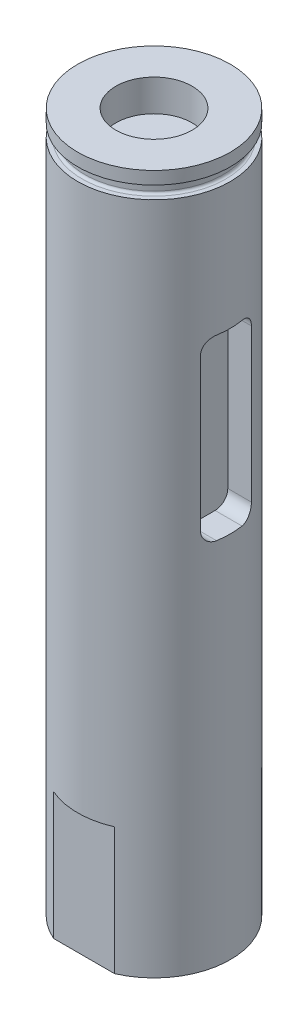
ISO-10303-21;
HEADER;
FILE_DESCRIPTION(('STEP AP214'),'2;1');
FILE_NAME('part.step','',(''),(''),'','','');
FILE_SCHEMA(('AUTOMOTIVE_DESIGN { 1 0 10303 214 1 1 1 1 }'));
ENDSEC;
DATA;
#1=APPLICATION_CONTEXT('core data for automotive mechanical design processes');
#2=APPLICATION_PROTOCOL_DEFINITION('international standard','automotive_design',2000,#1);
#3=PRODUCT_CONTEXT('',#1,'mechanical');
#4=PRODUCT('Part','Part','',(#3));
#5=PRODUCT_RELATED_PRODUCT_CATEGORY('part','',(#4));
#6=PRODUCT_DEFINITION_FORMATION('','',#4);
#7=PRODUCT_DEFINITION_CONTEXT('part definition',#1,'design');
#8=PRODUCT_DEFINITION('design','',#6,#7);
#9=PRODUCT_DEFINITION_SHAPE('','',#8);
#10=(LENGTH_UNIT() NAMED_UNIT(*) SI_UNIT(.MILLI.,.METRE.));
#11=(NAMED_UNIT(*) PLANE_ANGLE_UNIT() SI_UNIT($,.RADIAN.));
#12=(NAMED_UNIT(*) SI_UNIT($,.STERADIAN.) SOLID_ANGLE_UNIT());
#13=UNCERTAINTY_MEASURE_WITH_UNIT(LENGTH_MEASURE(1.E-05),#10,'distance_accuracy_value','');
#14=(GEOMETRIC_REPRESENTATION_CONTEXT(3) GLOBAL_UNCERTAINTY_ASSIGNED_CONTEXT((#13)) GLOBAL_UNIT_ASSIGNED_CONTEXT((#10,
#11,#12)) REPRESENTATION_CONTEXT('',''));
#15=CARTESIAN_POINT('',(0.,0.,0.));
#16=DIRECTION('',(0.,0.,1.));
#17=DIRECTION('',(1.,0.,0.));
#18=AXIS2_PLACEMENT_3D('',#15,#16,#17);
#19=CARTESIAN_POINT('',(0.,14.,0.));
#20=DIRECTION('',(0.,-1.,0.));
#21=DIRECTION('',(0.,0.,-1.));
#22=AXIS2_PLACEMENT_3D('',#19,#20,#21);
#23=CYLINDRICAL_SURFACE('',#22,6.);
#24=CARTESIAN_POINT('',(0.,26.,0.));
#25=DIRECTION('',(0.,1.,0.));
#26=DIRECTION('',(0.,0.,1.));
#27=AXIS2_PLACEMENT_3D('',#24,#25,#26);
#28=CIRCLE('',#27,6.);
#29=CARTESIAN_POINT('',(0.,26.,6.));
#30=VERTEX_POINT('',#29);
#31=EDGE_CURVE('E219',#30,#30,#28,.T.);
#32=ORIENTED_EDGE('',*,*,#31,.F.);
#33=EDGE_LOOP('',(#32));
#34=FACE_BOUND('',#33,.T.);
#35=CARTESIAN_POINT('',(0.,25.,0.));
#36=DIRECTION('',(0.,-1.,0.));
#37=DIRECTION('',(0.,0.,-1.));
#38=AXIS2_PLACEMENT_3D('',#35,#36,#37);
#39=CIRCLE('',#38,6.);
#40=CARTESIAN_POINT('',(0.,25.,-6.));
#41=VERTEX_POINT('',#40);
#42=EDGE_CURVE('E223',#41,#41,#39,.T.);
#43=ORIENTED_EDGE('',*,*,#42,.F.);
#44=EDGE_LOOP('',(#43));
#45=FACE_BOUND('',#44,.T.);
#46=ADVANCED_FACE('F41',(#34,#45),#23,.T.);
#47=CARTESIAN_POINT('',(0.,26.,0.));
#48=DIRECTION('',(0.,1.,0.));
#49=DIRECTION('',(0.,0.,1.));
#50=AXIS2_PLACEMENT_3D('',#47,#48,#49);
#51=PLANE('',#50);
#52=CARTESIAN_POINT('',(0.,26.,0.));
#53=DIRECTION('',(0.,1.,0.));
#54=DIRECTION('',(0.,0.,1.));
#55=AXIS2_PLACEMENT_3D('',#52,#53,#54);
#56=CIRCLE('',#55,3.);
#57=CARTESIAN_POINT('',(0.,26.,3.));
#58=VERTEX_POINT('',#57);
#59=EDGE_CURVE('E135',#58,#58,#56,.T.);
#60=ORIENTED_EDGE('',*,*,#59,.F.);
#61=EDGE_LOOP('',(#60));
#62=FACE_BOUND('',#61,.T.);
#63=ORIENTED_EDGE('',*,*,#31,.T.);
#64=EDGE_LOOP('',(#63));
#65=FACE_BOUND('',#64,.T.);
#66=ADVANCED_FACE('F302',(#62,#65),#51,.T.);
#67=CARTESIAN_POINT('',(-5.5030110244233,25.,-1.28037871939337));
#68=DIRECTION('',(0.,-1.,0.));
#69=DIRECTION('',(0.,0.,-1.));
#70=AXIS2_PLACEMENT_3D('',#67,#68,#69);
#71=PLANE('',#70);
#72=CARTESIAN_POINT('',(0.,25.,0.));
#73=DIRECTION('',(0.,-1.,0.));
#74=DIRECTION('',(0.,0.,-1.));
#75=AXIS2_PLACEMENT_3D('',#72,#73,#74);
#76=CIRCLE('',#75,5.64999999999998);
#77=CARTESIAN_POINT('',(0.,25.,-5.64999999999998));
#78=VERTEX_POINT('',#77);
#79=EDGE_CURVE('E215',#78,#78,#76,.T.);
#80=ORIENTED_EDGE('',*,*,#79,.F.);
#81=EDGE_LOOP('',(#80));
#82=FACE_BOUND('',#81,.T.);
#83=ORIENTED_EDGE('',*,*,#42,.T.);
#84=EDGE_LOOP('',(#83));
#85=FACE_BOUND('',#84,.T.);
#86=ADVANCED_FACE('F307',(#82,#85),#71,.T.);
#87=CARTESIAN_POINT('',(-6.98833700889154,24.,-1.6259676657783));
#88=DIRECTION('',(0.,1.,0.));
#89=DIRECTION('',(0.,0.,1.));
#90=AXIS2_PLACEMENT_3D('',#87,#88,#89);
#91=PLANE('',#90);
#92=CARTESIAN_POINT('',(0.,24.,0.));
#93=DIRECTION('',(0.,-1.,0.));
#94=DIRECTION('',(0.,0.,-1.));
#95=AXIS2_PLACEMENT_3D('',#92,#93,#94);
#96=CIRCLE('',#95,5.64999999999998);
#97=CARTESIAN_POINT('',(0.,24.,-5.64999999999998));
#98=VERTEX_POINT('',#97);
#99=EDGE_CURVE('E187',#98,#98,#96,.T.);
#100=ORIENTED_EDGE('',*,*,#99,.T.);
#101=EDGE_LOOP('',(#100));
#102=FACE_BOUND('',#101,.T.);
#103=CARTESIAN_POINT('',(0.,24.,0.));
#104=DIRECTION('',(0.,1.,0.));
#105=DIRECTION('',(0.,0.,1.));
#106=AXIS2_PLACEMENT_3D('',#103,#104,#105);
#107=CIRCLE('',#106,6.);
#108=CARTESIAN_POINT('',(0.,24.,6.));
#109=VERTEX_POINT('',#108);
#110=EDGE_CURVE('E218',#109,#109,#107,.T.);
#111=ORIENTED_EDGE('',*,*,#110,.T.);
#112=EDGE_LOOP('',(#111));
#113=FACE_BOUND('',#112,.T.);
#114=ADVANCED_FACE('F266',(#102,#113),#91,.T.);
#115=CARTESIAN_POINT('',(0.,24.8,0.));
#116=DIRECTION('',(0.,-1.,0.));
#117=DIRECTION('',(0.,0.,-1.));
#118=AXIS2_PLACEMENT_3D('',#115,#116,#117);
#119=TOROIDAL_SURFACE('',#118,5.64999999999998,0.199999999999999);
#120=ORIENTED_EDGE('',*,*,#79,.T.);
#121=EDGE_LOOP('',(#120));
#122=FACE_BOUND('',#121,.T.);
#123=CARTESIAN_POINT('',(0.,24.8,0.));
#124=DIRECTION('',(0.,-1.,0.));
#125=DIRECTION('',(0.,0.,-1.));
#126=AXIS2_PLACEMENT_3D('',#123,#124,#125);
#127=CIRCLE('',#126,5.44999999999998);
#128=CARTESIAN_POINT('',(0.,24.8,-5.44999999999998));
#129=VERTEX_POINT('',#128);
#130=EDGE_CURVE('E212',#129,#129,#127,.T.);
#131=ORIENTED_EDGE('',*,*,#130,.F.);
#132=EDGE_LOOP('',(#131));
#133=FACE_BOUND('',#132,.T.);
#134=ADVANCED_FACE('F321',(#122,#133),#119,.F.);
#135=CARTESIAN_POINT('',(0.,60.2246155762171,0.));
#136=DIRECTION('',(0.,-1.,0.));
#137=DIRECTION('',(0.,0.,-1.));
#138=AXIS2_PLACEMENT_3D('',#135,#136,#137);
#139=CYLINDRICAL_SURFACE('',#138,5.44999999999998);
#140=ORIENTED_EDGE('',*,*,#130,.T.);
#141=EDGE_LOOP('',(#140));
#142=FACE_BOUND('',#141,.T.);
#143=CARTESIAN_POINT('',(0.,24.2,0.));
#144=DIRECTION('',(0.,-1.,0.));
#145=DIRECTION('',(0.,0.,-1.));
#146=AXIS2_PLACEMENT_3D('',#143,#144,#145);
#147=CIRCLE('',#146,5.44999999999998);
#148=CARTESIAN_POINT('',(0.,24.2,-5.44999999999998));
#149=VERTEX_POINT('',#148);
#150=EDGE_CURVE('E209',#149,#149,#147,.T.);
#151=ORIENTED_EDGE('',*,*,#150,.F.);
#152=EDGE_LOOP('',(#151));
#153=FACE_BOUND('',#152,.T.);
#154=ADVANCED_FACE('F316',(#142,#153),#139,.T.);
#155=CARTESIAN_POINT('',(0.,24.2,0.));
#156=DIRECTION('',(0.,-1.,0.));
#157=DIRECTION('',(0.,0.,-1.));
#158=AXIS2_PLACEMENT_3D('',#155,#156,#157);
#159=TOROIDAL_SURFACE('',#158,5.64999999999998,0.200000000000001);
#160=ORIENTED_EDGE('',*,*,#150,.T.);
#161=EDGE_LOOP('',(#160));
#162=FACE_BOUND('',#161,.T.);
#163=ORIENTED_EDGE('',*,*,#99,.F.);
#164=EDGE_LOOP('',(#163));
#165=FACE_BOUND('',#164,.T.);
#166=ADVANCED_FACE('F312',(#162,#165),#159,.F.);
#167=CARTESIAN_POINT('',(5.65685424949238,13.,2.));
#168=CARTESIAN_POINT('',(5.65685281758847,13.0271406195603,2.00000068443079));
#169=CARTESIAN_POINT('',(5.65724528085204,13.0542675920684,1.99889434448995));
#170=CARTESIAN_POINT('',(5.6588012761065,13.1083144843186,1.99448646917785));
#171=CARTESIAN_POINT('',(5.65996464010897,13.1352344478778,1.99118541206102));
#172=CARTESIAN_POINT('',(5.66457521184169,13.2152401355786,1.97804922022411));
#173=CARTESIAN_POINT('',(5.66914314724227,13.2677689800047,1.96498074668407));
#174=CARTESIAN_POINT('',(5.68090860038521,13.3697230095197,1.93069959561032));
#175=CARTESIAN_POINT('',(5.68810526955666,13.4191491901403,1.9094895461135));
#176=CARTESIAN_POINT('',(5.70460377121356,13.5137250019919,1.85961919606177));
#177=CARTESIAN_POINT('',(5.71390655255376,13.5588726926135,1.8309555366067));
#178=CARTESIAN_POINT('',(5.73431154730347,13.6451375632919,1.76602975759629));
#179=CARTESIAN_POINT('',(5.74546034987069,13.6860878211444,1.72956083672167));
#180=CARTESIAN_POINT('',(5.76864525641675,13.7613938194103,1.65058296050603));
#181=CARTESIAN_POINT('',(5.78068166050162,13.7957473151193,1.60807195773592));
#182=CARTESIAN_POINT('',(5.80552437460228,13.8584792321005,1.51600134393854));
#183=CARTESIAN_POINT('',(5.81834064122393,13.8865103779642,1.4662075429958));
#184=CARTESIAN_POINT('',(5.84349667083966,13.9337243082299,1.36249366414905));
#185=CARTESIAN_POINT('',(5.85583668949863,13.9529119024149,1.30857584784197));
#186=CARTESIAN_POINT('',(5.87643252247859,13.9781638653744,1.21215171656683));
#187=CARTESIAN_POINT('',(5.88492838409539,13.9863254878199,1.17023429589879));
#188=CARTESIAN_POINT('',(5.90113547403364,13.997246789207,1.08558012495498));
#189=CARTESIAN_POINT('',(5.9088471580345,14.0000096225441,1.04284386785744));
#190=CARTESIAN_POINT('',(5.91607978309962,14.,0.999999999999991));
#191=B_SPLINE_CURVE_WITH_KNOTS('',3,(#167,#168,#169,#170,#171,#172,#173,#174,#175,#176,#177,
#178,#179,#180,#181,#182,#183,#184,#185,#186,#187,#188,#189,#190),.UNSPECIFIED.,.F.,.F.,(4,2,2,
2,2,2,2,2,2,2,2,4),(0.,0.0813697321983587,0.162721738793672,0.32484161317144,0.486909200471364,
0.649049948975738,0.816183527372726,0.98337387653829,1.15825003972454,1.33303097964982,
1.46332089535386,1.59353466269523),.UNSPECIFIED.);
#192=CARTESIAN_POINT('',(5.65685424949238,13.,2.));
#193=VERTEX_POINT('',#192);
#194=CARTESIAN_POINT('',(5.91607978309962,14.,0.999999999999991));
#195=VERTEX_POINT('',#194);
#196=EDGE_CURVE('E11',#193,#195,#191,.T.);
#197=ORIENTED_EDGE('',*,*,#196,.T.);
#198=CARTESIAN_POINT('',(0.,14.,0.));
#199=DIRECTION('',(0.,1.,0.));
#200=DIRECTION('',(0.,0.,1.));
#201=AXIS2_PLACEMENT_3D('',#198,#199,#200);
#202=CIRCLE('',#201,6.);
#203=CARTESIAN_POINT('',(5.91607978309962,14.,-0.999999999999995));
#204=VERTEX_POINT('',#203);
#205=EDGE_CURVE('E222',#195,#204,#202,.T.);
#206=ORIENTED_EDGE('',*,*,#205,.T.);
#207=CARTESIAN_POINT('',(5.91607978309962,14.,-0.999999999999995));
#208=CARTESIAN_POINT('',(5.90640201240202,14.0000405759305,-1.05744405022136));
#209=CARTESIAN_POINT('',(5.89583336415347,13.9950540251957,-1.11469490219437));
#210=CARTESIAN_POINT('',(5.87342883441462,13.9755064421206,-1.22719911952359));
#211=CARTESIAN_POINT('',(5.86159482267549,13.9609593774531,-1.28245527503211));
#212=CARTESIAN_POINT('',(5.83714545083267,13.9227718025127,-1.3895245154396));
#213=CARTESIAN_POINT('',(5.82453024988558,13.8991331394476,-1.44133829724499));
#214=CARTESIAN_POINT('',(5.79916937690871,13.8434427114986,-1.54020609997988));
#215=CARTESIAN_POINT('',(5.78642367719668,13.8113891245001,-1.58725908697602));
#216=CARTESIAN_POINT('',(5.76135962724091,13.7391715845628,-1.67597570419013));
#217=CARTESIAN_POINT('',(5.74904982620252,13.6988997432736,-1.71755407861729));
#218=CARTESIAN_POINT('',(5.72586828747516,13.6115398739341,-1.79332249125908));
#219=CARTESIAN_POINT('',(5.71499666127697,13.5644513180274,-1.82751195679762));
#220=CARTESIAN_POINT('',(5.69567987862656,13.465585087445,-1.88684681266635));
#221=CARTESIAN_POINT('',(5.68719561514925,13.4139038103449,-1.91213990115031));
#222=CARTESIAN_POINT('',(5.67310524768226,13.3066504059048,-1.95355076042549));
#223=CARTESIAN_POINT('',(5.66749538055871,13.2510834745676,-1.96968053077614));
#224=CARTESIAN_POINT('',(5.6613503883933,13.1625046523593,-1.98724803334924));
#225=CARTESIAN_POINT('',(5.65966926284069,13.1301979434468,-1.99202469666343));
#226=CARTESIAN_POINT('',(5.65741979831632,13.0652670547078,-1.99840074381591));
#227=CARTESIAN_POINT('',(5.65685035299174,13.0326432230228,-2.0000032865869));
#228=CARTESIAN_POINT('',(5.65685424949238,13.,-2.));
#229=B_SPLINE_CURVE_WITH_KNOTS('',3,(#207,#208,#209,#210,#211,#212,#213,#214,#215,#216,#217,
#218,#219,#220,#221,#222,#223,#224,#225,#226,#227,#228),.UNSPECIFIED.,.F.,.F.,(4,2,2,2,2,2,2,2,
2,2,4),(0.,0.174480157541033,0.34870596889463,0.522896400176898,0.697124580713412,
0.873807076246497,1.05050326061842,1.22410957268253,1.39748801643219,1.49543358137948,
1.59328162034533),.UNSPECIFIED.);
#230=CARTESIAN_POINT('',(5.65685424949238,13.,-2.));
#231=VERTEX_POINT('',#230);
#232=EDGE_CURVE('E233',#204,#231,#229,.T.);
#233=ORIENTED_EDGE('',*,*,#232,.T.);
#234=DIRECTION('',(0.,-1.,0.));
#235=VECTOR('',#234,1.);
#236=CARTESIAN_POINT('',(5.65685424949238,14.,-2.));
#237=LINE('',#236,#235);
#238=CARTESIAN_POINT('',(5.65685424949238,1.00000000000001,-2.));
#239=VERTEX_POINT('',#238);
#240=EDGE_CURVE('E276',#231,#239,#237,.T.);
#241=ORIENTED_EDGE('',*,*,#240,.T.);
#242=CARTESIAN_POINT('',(5.65685424949238,1.00000000000001,-2.));
#243=CARTESIAN_POINT('',(5.65685281758846,0.972859380439662,-2.00000068443079));
#244=CARTESIAN_POINT('',(5.65724528085204,0.945732407931599,-1.99889434448995));
#245=CARTESIAN_POINT('',(5.6588012761065,0.891685515681443,-1.99448646917786));
#246=CARTESIAN_POINT('',(5.65996464010897,0.864765552122218,-1.99118541206103));
#247=CARTESIAN_POINT('',(5.66457521184169,0.784759864421369,-1.97804922022412));
#248=CARTESIAN_POINT('',(5.66914314724227,0.732231019995348,-1.96498074668407));
#249=CARTESIAN_POINT('',(5.68090860038521,0.630276990480267,-1.93069959561032));
#250=CARTESIAN_POINT('',(5.68810526955666,0.580850809859671,-1.90948954611351));
#251=CARTESIAN_POINT('',(5.70460377121355,0.486274998008095,-1.85961919606177));
#252=CARTESIAN_POINT('',(5.71390655255376,0.441127307386551,-1.8309555366067));
#253=CARTESIAN_POINT('',(5.73431154730347,0.35486243670811,-1.76602975759629));
#254=CARTESIAN_POINT('',(5.74546034987069,0.313912178855592,-1.72956083672168));
#255=CARTESIAN_POINT('',(5.76864525641675,0.238606180589669,-1.65058296050604));
#256=CARTESIAN_POINT('',(5.78068166050162,0.204252684880717,-1.60807195773592));
#257=CARTESIAN_POINT('',(5.80552437460228,0.141520767899505,-1.51600134393854));
#258=CARTESIAN_POINT('',(5.81834064122393,0.113489622035831,-1.4662075429958));
#259=CARTESIAN_POINT('',(5.84349667083966,0.0662756917701232,-1.36249366414905));
#260=CARTESIAN_POINT('',(5.85583668949863,0.0470880975850982,-1.30857584784197));
#261=CARTESIAN_POINT('',(5.87643252247859,0.0218361346256207,-1.21215171656684));
#262=CARTESIAN_POINT('',(5.88492838409539,0.0136745121800794,-1.1702342958988));
#263=CARTESIAN_POINT('',(5.90113547403364,0.00275321079297573,-1.08558012495499));
#264=CARTESIAN_POINT('',(5.9088471580345,-9.62254404861712E-06,-1.04284386785744));
#265=CARTESIAN_POINT('',(5.91607978309962,0.,-0.999999999999996));
#266=B_SPLINE_CURVE_WITH_KNOTS('',3,(#242,#243,#244,#245,#246,#247,#248,#249,#250,#251,#252,
#253,#254,#255,#256,#257,#258,#259,#260,#261,#262,#263,#264,#265),.UNSPECIFIED.,.F.,.F.,(4,2,2,
2,2,2,2,2,2,2,2,4),(0.,0.0813697321983577,0.162721738793671,0.32484161317144,0.486909200471364,
0.649049948975738,0.816183527372726,0.983373876538293,1.15825003972454,1.33303097964982,
1.46332089535386,1.59353466269523),.UNSPECIFIED.);
#267=CARTESIAN_POINT('',(5.91607978309962,0.,-0.999999999999996));
#268=VERTEX_POINT('',#267);
#269=EDGE_CURVE('E54',#239,#268,#266,.T.);
#270=ORIENTED_EDGE('',*,*,#269,.T.);
#271=CARTESIAN_POINT('',(0.,0.,0.));
#272=DIRECTION('',(0.,-1.,0.));
#273=DIRECTION('',(0.,0.,-1.));
#274=AXIS2_PLACEMENT_3D('',#271,#272,#273);
#275=CIRCLE('',#274,6.);
#276=CARTESIAN_POINT('',(5.91607978309962,0.,0.999999999999989));
#277=VERTEX_POINT('',#276);
#278=EDGE_CURVE('E230',#268,#277,#275,.T.);
#279=ORIENTED_EDGE('',*,*,#278,.T.);
#280=CARTESIAN_POINT('',(5.91607978309962,0.,0.99999999999999));
#281=CARTESIAN_POINT('',(5.90640201240201,-4.05759305357382E-05,1.05744405022135));
#282=CARTESIAN_POINT('',(5.89583336415347,0.00494597480426904,1.11469490219436));
#283=CARTESIAN_POINT('',(5.87342883441462,0.0244935578794028,1.22719911952358));
#284=CARTESIAN_POINT('',(5.86159482267549,0.0390406225469024,1.28245527503211));
#285=CARTESIAN_POINT('',(5.83714545083268,0.077228197487285,1.38952451543959));
#286=CARTESIAN_POINT('',(5.82453024988558,0.100866860552415,1.44133829724499));
#287=CARTESIAN_POINT('',(5.79916937690871,0.156557288501386,1.54020609997988));
#288=CARTESIAN_POINT('',(5.78642367719668,0.188610875499884,1.58725908697602));
#289=CARTESIAN_POINT('',(5.76135962724091,0.26082841543718,1.67597570419013));
#290=CARTESIAN_POINT('',(5.74904982620252,0.301100256726368,1.71755407861728));
#291=CARTESIAN_POINT('',(5.72586828747516,0.388460126065906,1.79332249125907));
#292=CARTESIAN_POINT('',(5.71499666127698,0.43554868197257,1.82751195679762));
#293=CARTESIAN_POINT('',(5.69567987862656,0.534414912554957,1.88684681266634));
#294=CARTESIAN_POINT('',(5.68719561514925,0.586096189655145,1.91213990115031));
#295=CARTESIAN_POINT('',(5.67310524768226,0.693349594095185,1.95355076042549));
#296=CARTESIAN_POINT('',(5.66749538055871,0.748916525432396,1.96968053077614));
#297=CARTESIAN_POINT('',(5.6613503883933,0.83749534764073,1.98724803334924));
#298=CARTESIAN_POINT('',(5.65966926284069,0.869802056553253,1.99202469666342));
#299=CARTESIAN_POINT('',(5.65741979831632,0.934732945292193,1.99840074381591));
#300=CARTESIAN_POINT('',(5.65685035299174,0.967356776977183,2.0000032865869));
#301=CARTESIAN_POINT('',(5.65685424949238,1.00000000000001,2.));
#302=B_SPLINE_CURVE_WITH_KNOTS('',3,(#280,#281,#282,#283,#284,#285,#286,#287,#288,#289,#290,
#291,#292,#293,#294,#295,#296,#297,#298,#299,#300,#301),.UNSPECIFIED.,.F.,.F.,(4,2,2,2,2,2,2,2,
2,2,4),(0.,0.174480157541033,0.34870596889463,0.522896400176899,0.697124580713412,
0.8738070762465,1.05050326061842,1.22410957268253,1.39748801643219,1.49543358137948,
1.59328162034533),.UNSPECIFIED.);
#303=CARTESIAN_POINT('',(5.65685424949238,1.00000000000001,2.));
#304=VERTEX_POINT('',#303);
#305=EDGE_CURVE('E241',#277,#304,#302,.T.);
#306=ORIENTED_EDGE('',*,*,#305,.T.);
#307=DIRECTION('',(0.,-1.,0.));
#308=VECTOR('',#307,1.);
#309=CARTESIAN_POINT('',(5.65685424949238,14.,2.));
#310=LINE('',#309,#308);
#311=EDGE_CURVE('E274',#304,#193,#310,.F.);
#312=ORIENTED_EDGE('',*,*,#311,.T.);
#313=EDGE_LOOP('',(#197,#206,#233,#241,#270,#279,#306,#312));
#314=FACE_BOUND('',#313,.T.);
#315=ORIENTED_EDGE('',*,*,#110,.F.);
#316=EDGE_LOOP('',(#315));
#317=FACE_BOUND('',#316,.T.);
#318=CARTESIAN_POINT('',(0.,-19.,0.));
#319=DIRECTION('',(0.,-1.,0.));
#320=DIRECTION('',(0.,0.,-1.));
#321=AXIS2_PLACEMENT_3D('',#318,#319,#320);
#322=CIRCLE('',#321,6.);
#323=CARTESIAN_POINT('',(2.39791576165636,-19.,5.5));
#324=VERTEX_POINT('',#323);
#325=CARTESIAN_POINT('',(-2.39791576165636,-19.,5.5));
#326=VERTEX_POINT('',#325);
#327=EDGE_CURVE('E147',#324,#326,#322,.T.);
#328=ORIENTED_EDGE('',*,*,#327,.F.);
#329=DIRECTION('',(0.,-1.,0.));
#330=VECTOR('',#329,1.);
#331=CARTESIAN_POINT('',(2.39791576165636,-19.,5.5));
#332=LINE('',#331,#330);
#333=CARTESIAN_POINT('',(2.39791576165636,-29.,5.5));
#334=VERTEX_POINT('',#333);
#335=EDGE_CURVE('E153',#324,#334,#332,.T.);
#336=ORIENTED_EDGE('',*,*,#335,.T.);
#337=CARTESIAN_POINT('',(0.,-29.,0.));
#338=DIRECTION('',(0.,-1.,0.));
#339=DIRECTION('',(0.,0.,1.));
#340=AXIS2_PLACEMENT_3D('',#337,#338,#339);
#341=CIRCLE('',#340,6.);
#342=CARTESIAN_POINT('',(-2.39791576165636,-29.,5.5));
#343=VERTEX_POINT('',#342);
#344=EDGE_CURVE('E156',#343,#334,#341,.T.);
#345=ORIENTED_EDGE('',*,*,#344,.F.);
#346=DIRECTION('',(0.,-1.,0.));
#347=VECTOR('',#346,1.);
#348=CARTESIAN_POINT('',(-2.39791576165636,-19.,5.5));
#349=LINE('',#348,#347);
#350=EDGE_CURVE('E61',#326,#343,#349,.T.);
#351=ORIENTED_EDGE('',*,*,#350,.F.);
#352=EDGE_LOOP('',(#328,#336,#345,#351));
#353=FACE_BOUND('',#352,.T.);
#354=ADVANCED_FACE('F264',(#314,#317,#353),#23,.T.);
#355=CARTESIAN_POINT('',(3.8,1.,-1.));
#356=DIRECTION('',(1.,0.,0.));
#357=DIRECTION('',(0.,0.,-1.));
#358=AXIS2_PLACEMENT_3D('',#355,#356,#357);
#359=CYLINDRICAL_SURFACE('',#358,1.);
#360=DIRECTION('',(1.,0.,0.));
#361=VECTOR('',#360,1.);
#362=CARTESIAN_POINT('',(3.8,1.00000000000001,-2.));
#363=LINE('',#362,#361);
#364=CARTESIAN_POINT('',(3.8,1.00000000000001,-2.));
#365=VERTEX_POINT('',#364);
#366=EDGE_CURVE('E69',#365,#239,#363,.T.);
#367=ORIENTED_EDGE('',*,*,#366,.F.);
#368=CARTESIAN_POINT('',(3.8,1.,-1.));
#369=DIRECTION('',(1.,0.,0.));
#370=DIRECTION('',(0.,0.,-1.));
#371=AXIS2_PLACEMENT_3D('',#368,#369,#370);
#372=CIRCLE('',#371,1.);
#373=CARTESIAN_POINT('',(3.8,0.,-0.999999999999996));
#374=VERTEX_POINT('',#373);
#375=EDGE_CURVE('E160',#374,#365,#372,.T.);
#376=ORIENTED_EDGE('',*,*,#375,.F.);
#377=DIRECTION('',(1.,0.,0.));
#378=VECTOR('',#377,1.);
#379=CARTESIAN_POINT('',(3.8,0.,-0.999999999999996));
#380=LINE('',#379,#378);
#381=EDGE_CURVE('E184',#374,#268,#380,.T.);
#382=ORIENTED_EDGE('',*,*,#381,.T.);
#383=ORIENTED_EDGE('',*,*,#269,.F.);
#384=EDGE_LOOP('',(#367,#376,#382,#383));
#385=FACE_BOUND('',#384,.T.);
#386=ADVANCED_FACE('F259',(#385),#359,.F.);
#387=CARTESIAN_POINT('',(3.8,0.,0.999999999999989));
#388=DIRECTION('',(0.,-1.,0.));
#389=DIRECTION('',(0.,0.,-1.));
#390=AXIS2_PLACEMENT_3D('',#387,#388,#389);
#391=PLANE('',#390);
#392=ORIENTED_EDGE('',*,*,#381,.F.);
#393=DIRECTION('',(0.,0.,-1.));
#394=VECTOR('',#393,1.);
#395=CARTESIAN_POINT('',(3.8,0.,0.999999999999989));
#396=LINE('',#395,#394);
#397=CARTESIAN_POINT('',(3.8,0.,0.999999999999989));
#398=VERTEX_POINT('',#397);
#399=EDGE_CURVE('E181',#398,#374,#396,.T.);
#400=ORIENTED_EDGE('',*,*,#399,.F.);
#401=DIRECTION('',(1.,0.,0.));
#402=VECTOR('',#401,1.);
#403=CARTESIAN_POINT('',(3.8,0.,0.999999999999989));
#404=LINE('',#403,#402);
#405=EDGE_CURVE('E188',#398,#277,#404,.T.);
#406=ORIENTED_EDGE('',*,*,#405,.T.);
#407=ORIENTED_EDGE('',*,*,#278,.F.);
#408=EDGE_LOOP('',(#392,#400,#406,#407));
#409=FACE_BOUND('',#408,.T.);
#410=ADVANCED_FACE('F263',(#409),#391,.F.);
#411=CARTESIAN_POINT('',(3.8,1.,0.999999999999997));
#412=DIRECTION('',(1.,0.,0.));
#413=DIRECTION('',(0.,0.,-1.));
#414=AXIS2_PLACEMENT_3D('',#411,#412,#413);
#415=CYLINDRICAL_SURFACE('',#414,1.);
#416=ORIENTED_EDGE('',*,*,#405,.F.);
#417=CARTESIAN_POINT('',(3.8,1.,0.999999999999997));
#418=DIRECTION('',(1.,0.,0.));
#419=DIRECTION('',(0.,0.,-1.));
#420=AXIS2_PLACEMENT_3D('',#417,#418,#419);
#421=CIRCLE('',#420,1.);
#422=CARTESIAN_POINT('',(3.8,1.00000000000001,2.));
#423=VERTEX_POINT('',#422);
#424=EDGE_CURVE('E178',#423,#398,#421,.T.);
#425=ORIENTED_EDGE('',*,*,#424,.F.);
#426=DIRECTION('',(1.,0.,0.));
#427=VECTOR('',#426,1.);
#428=CARTESIAN_POINT('',(3.8,1.00000000000001,2.));
#429=LINE('',#428,#427);
#430=EDGE_CURVE('E191',#423,#304,#429,.T.);
#431=ORIENTED_EDGE('',*,*,#430,.T.);
#432=ORIENTED_EDGE('',*,*,#305,.F.);
#433=EDGE_LOOP('',(#416,#425,#431,#432));
#434=FACE_BOUND('',#433,.T.);
#435=ADVANCED_FACE('F282',(#434),#415,.F.);
#436=CARTESIAN_POINT('',(3.8,13.,2.));
#437=DIRECTION('',(0.,0.,1.));
#438=DIRECTION('',(0.,-1.,0.));
#439=AXIS2_PLACEMENT_3D('',#436,#437,#438);
#440=PLANE('',#439);
#441=ORIENTED_EDGE('',*,*,#430,.F.);
#442=DIRECTION('',(0.,-1.,0.));
#443=VECTOR('',#442,1.);
#444=CARTESIAN_POINT('',(3.8,13.,2.));
#445=LINE('',#444,#443);
#446=CARTESIAN_POINT('',(3.8,13.,2.));
#447=VERTEX_POINT('',#446);
#448=EDGE_CURVE('E175',#447,#423,#445,.T.);
#449=ORIENTED_EDGE('',*,*,#448,.F.);
#450=DIRECTION('',(1.,0.,0.));
#451=VECTOR('',#450,1.);
#452=CARTESIAN_POINT('',(3.8,13.,2.));
#453=LINE('',#452,#451);
#454=EDGE_CURVE('E194',#447,#193,#453,.T.);
#455=ORIENTED_EDGE('',*,*,#454,.T.);
#456=ORIENTED_EDGE('',*,*,#311,.F.);
#457=EDGE_LOOP('',(#441,#449,#455,#456));
#458=FACE_BOUND('',#457,.T.);
#459=ADVANCED_FACE('F291',(#458),#440,.F.);
#460=CARTESIAN_POINT('',(3.8,13.,0.999999999999998));
#461=DIRECTION('',(1.,0.,0.));
#462=DIRECTION('',(0.,0.,-1.));
#463=AXIS2_PLACEMENT_3D('',#460,#461,#462);
#464=CYLINDRICAL_SURFACE('',#463,1.);
#465=ORIENTED_EDGE('',*,*,#454,.F.);
#466=CARTESIAN_POINT('',(3.8,13.,0.999999999999998));
#467=DIRECTION('',(1.,0.,0.));
#468=DIRECTION('',(0.,0.,-1.));
#469=AXIS2_PLACEMENT_3D('',#466,#467,#468);
#470=CIRCLE('',#469,1.);
#471=CARTESIAN_POINT('',(3.8,14.,0.999999999999991));
#472=VERTEX_POINT('',#471);
#473=EDGE_CURVE('E172',#472,#447,#470,.T.);
#474=ORIENTED_EDGE('',*,*,#473,.F.);
#475=DIRECTION('',(1.,0.,0.));
#476=VECTOR('',#475,1.);
#477=CARTESIAN_POINT('',(3.8,14.,0.999999999999991));
#478=LINE('',#477,#476);
#479=EDGE_CURVE('E197',#472,#195,#478,.T.);
#480=ORIENTED_EDGE('',*,*,#479,.T.);
#481=ORIENTED_EDGE('',*,*,#196,.F.);
#482=EDGE_LOOP('',(#465,#474,#480,#481));
#483=FACE_BOUND('',#482,.T.);
#484=ADVANCED_FACE('F293',(#483),#464,.F.);
#485=CARTESIAN_POINT('',(3.8,14.,0.999999999999991));
#486=DIRECTION('',(0.,1.,0.));
#487=DIRECTION('',(0.,0.,1.));
#488=AXIS2_PLACEMENT_3D('',#485,#486,#487);
#489=PLANE('',#488);
#490=ORIENTED_EDGE('',*,*,#479,.F.);
#491=DIRECTION('',(0.,0.,1.));
#492=VECTOR('',#491,1.);
#493=CARTESIAN_POINT('',(3.8,14.,0.999999999999991));
#494=LINE('',#493,#492);
#495=CARTESIAN_POINT('',(3.8,14.,-0.999999999999995));
#496=VERTEX_POINT('',#495);
#497=EDGE_CURVE('E169',#496,#472,#494,.T.);
#498=ORIENTED_EDGE('',*,*,#497,.F.);
#499=DIRECTION('',(1.,0.,0.));
#500=VECTOR('',#499,1.);
#501=CARTESIAN_POINT('',(3.8,14.,-0.999999999999995));
#502=LINE('',#501,#500);
#503=EDGE_CURVE('E200',#496,#204,#502,.T.);
#504=ORIENTED_EDGE('',*,*,#503,.T.);
#505=ORIENTED_EDGE('',*,*,#205,.F.);
#506=EDGE_LOOP('',(#490,#498,#504,#505));
#507=FACE_BOUND('',#506,.T.);
#508=ADVANCED_FACE('F254',(#507),#489,.F.);
#509=CARTESIAN_POINT('',(3.8,13.,-1.));
#510=DIRECTION('',(1.,0.,0.));
#511=DIRECTION('',(0.,0.,-1.));
#512=AXIS2_PLACEMENT_3D('',#509,#510,#511);
#513=CYLINDRICAL_SURFACE('',#512,1.);
#514=ORIENTED_EDGE('',*,*,#503,.F.);
#515=CARTESIAN_POINT('',(3.8,13.,-1.));
#516=DIRECTION('',(1.,0.,0.));
#517=DIRECTION('',(0.,0.,1.));
#518=AXIS2_PLACEMENT_3D('',#515,#516,#517);
#519=CIRCLE('',#518,1.);
#520=CARTESIAN_POINT('',(3.8,13.,-2.));
#521=VERTEX_POINT('',#520);
#522=EDGE_CURVE('E166',#521,#496,#519,.T.);
#523=ORIENTED_EDGE('',*,*,#522,.F.);
#524=DIRECTION('',(1.,0.,0.));
#525=VECTOR('',#524,1.);
#526=CARTESIAN_POINT('',(3.8,13.,-2.));
#527=LINE('',#526,#525);
#528=EDGE_CURVE('E203',#521,#231,#527,.T.);
#529=ORIENTED_EDGE('',*,*,#528,.T.);
#530=ORIENTED_EDGE('',*,*,#232,.F.);
#531=EDGE_LOOP('',(#514,#523,#529,#530));
#532=FACE_BOUND('',#531,.T.);
#533=ADVANCED_FACE('F248',(#532),#513,.F.);
#534=CARTESIAN_POINT('',(3.8,13.,-2.));
#535=DIRECTION('',(0.,0.,-1.));
#536=DIRECTION('',(0.,1.,0.));
#537=AXIS2_PLACEMENT_3D('',#534,#535,#536);
#538=PLANE('',#537);
#539=ORIENTED_EDGE('',*,*,#528,.F.);
#540=DIRECTION('',(0.,1.,0.));
#541=VECTOR('',#540,1.);
#542=CARTESIAN_POINT('',(3.8,13.,-2.));
#543=LINE('',#542,#541);
#544=EDGE_CURVE('E163',#365,#521,#543,.T.);
#545=ORIENTED_EDGE('',*,*,#544,.F.);
#546=ORIENTED_EDGE('',*,*,#366,.T.);
#547=ORIENTED_EDGE('',*,*,#240,.F.);
#548=EDGE_LOOP('',(#539,#545,#546,#547));
#549=FACE_BOUND('',#548,.T.);
#550=ADVANCED_FACE('F253',(#549),#538,.F.);
#551=CARTESIAN_POINT('',(3.8,1.,-1.));
#552=DIRECTION('',(1.,0.,0.));
#553=DIRECTION('',(0.,0.,-1.));
#554=AXIS2_PLACEMENT_3D('',#551,#552,#553);
#555=PLANE('',#554);
#556=ORIENTED_EDGE('',*,*,#375,.T.);
#557=ORIENTED_EDGE('',*,*,#544,.T.);
#558=ORIENTED_EDGE('',*,*,#522,.T.);
#559=ORIENTED_EDGE('',*,*,#497,.T.);
#560=ORIENTED_EDGE('',*,*,#473,.T.);
#561=ORIENTED_EDGE('',*,*,#448,.T.);
#562=ORIENTED_EDGE('',*,*,#424,.T.);
#563=ORIENTED_EDGE('',*,*,#399,.T.);
#564=EDGE_LOOP('',(#556,#557,#558,#559,#560,#561,#562,#563));
#565=FACE_BOUND('',#564,.T.);
#566=ADVANCED_FACE('F258',(#565),#555,.T.);
#567=CARTESIAN_POINT('',(0.,-29.,0.));
#568=DIRECTION('',(0.,1.,0.));
#569=DIRECTION('',(0.,0.,1.));
#570=AXIS2_PLACEMENT_3D('',#567,#568,#569);
#571=PLANE('',#570);
#572=CARTESIAN_POINT('',(0.,-29.,0.));
#573=DIRECTION('',(0.,-1.,0.));
#574=DIRECTION('',(0.,0.,-1.));
#575=AXIS2_PLACEMENT_3D('',#572,#573,#574);
#576=CIRCLE('',#575,1.65);
#577=CARTESIAN_POINT('',(0.,-29.,-1.65));
#578=VERTEX_POINT('',#577);
#579=EDGE_CURVE('E136',#578,#578,#576,.T.);
#580=ORIENTED_EDGE('',*,*,#579,.F.);
#581=EDGE_LOOP('',(#580));
#582=FACE_BOUND('',#581,.T.);
#583=ORIENTED_EDGE('',*,*,#344,.T.);
#584=DIRECTION('',(1.,0.,0.));
#585=VECTOR('',#584,1.);
#586=CARTESIAN_POINT('',(-2.39791576165636,-29.,5.5));
#587=LINE('',#586,#585);
#588=EDGE_CURVE('E145',#343,#334,#587,.T.);
#589=ORIENTED_EDGE('',*,*,#588,.F.);
#590=EDGE_LOOP('',(#583,#589));
#591=FACE_BOUND('',#590,.T.);
#592=ADVANCED_FACE('F354',(#582,#591),#571,.F.);
#593=CARTESIAN_POINT('',(-2.39791576165636,-19.,5.5));
#594=DIRECTION('',(0.,0.,-1.));
#595=DIRECTION('',(-1.,0.,0.));
#596=AXIS2_PLACEMENT_3D('',#593,#594,#595);
#597=PLANE('',#596);
#598=ORIENTED_EDGE('',*,*,#588,.T.);
#599=ORIENTED_EDGE('',*,*,#335,.F.);
#600=DIRECTION('',(1.,0.,0.));
#601=VECTOR('',#600,1.);
#602=CARTESIAN_POINT('',(-2.39791576165636,-19.,5.5));
#603=LINE('',#602,#601);
#604=EDGE_CURVE('E149',#326,#324,#603,.T.);
#605=ORIENTED_EDGE('',*,*,#604,.F.);
#606=ORIENTED_EDGE('',*,*,#350,.T.);
#607=EDGE_LOOP('',(#598,#599,#605,#606));
#608=FACE_BOUND('',#607,.T.);
#609=ADVANCED_FACE('F352',(#608),#597,.F.);
#610=CARTESIAN_POINT('',(0.,-19.,0.));
#611=DIRECTION('',(0.,-1.,0.));
#612=DIRECTION('',(0.,0.,-1.));
#613=AXIS2_PLACEMENT_3D('',#610,#611,#612);
#614=PLANE('',#613);
#615=ORIENTED_EDGE('',*,*,#327,.T.);
#616=ORIENTED_EDGE('',*,*,#604,.T.);
#617=EDGE_LOOP('',(#615,#616));
#618=FACE_BOUND('',#617,.T.);
#619=ADVANCED_FACE('F351',(#618),#614,.T.);
#620=CARTESIAN_POINT('',(0.,23.5,0.));
#621=DIRECTION('',(0.,1.,0.));
#622=DIRECTION('',(0.,0.,1.));
#623=AXIS2_PLACEMENT_3D('',#620,#621,#622);
#624=CYLINDRICAL_SURFACE('',#623,3.);
#625=CARTESIAN_POINT('',(0.,23.5,0.));
#626=DIRECTION('',(0.,1.,0.));
#627=DIRECTION('',(0.,0.,1.));
#628=AXIS2_PLACEMENT_3D('',#625,#626,#627);
#629=CIRCLE('',#628,3.);
#630=CARTESIAN_POINT('',(0.,23.5,3.));
#631=VERTEX_POINT('',#630);
#632=EDGE_CURVE('E139',#631,#631,#629,.T.);
#633=ORIENTED_EDGE('',*,*,#632,.F.);
#634=EDGE_LOOP('',(#633));
#635=FACE_BOUND('',#634,.T.);
#636=ORIENTED_EDGE('',*,*,#59,.T.);
#637=EDGE_LOOP('',(#636));
#638=FACE_BOUND('',#637,.T.);
#639=ADVANCED_FACE('F424',(#635,#638),#624,.F.);
#640=CARTESIAN_POINT('',(0.,23.5,0.));
#641=DIRECTION('',(0.,1.,0.));
#642=DIRECTION('',(0.,0.,1.));
#643=AXIS2_PLACEMENT_3D('',#640,#641,#642);
#644=PLANE('',#643);
#645=ORIENTED_EDGE('',*,*,#632,.T.);
#646=EDGE_LOOP('',(#645));
#647=FACE_BOUND('',#646,.T.);
#648=ADVANCED_FACE('F129',(#647),#644,.T.);
#649=CARTESIAN_POINT('',(0.,-19.,0.));
#650=DIRECTION('',(0.,-1.,0.));
#651=DIRECTION('',(0.,0.,-1.));
#652=AXIS2_PLACEMENT_3D('',#649,#650,#651);
#653=CONICAL_SURFACE('',#652,1.65,1.02974425867665);
#654=CARTESIAN_POINT('',(0.,-18.0085799786045,0.));
#655=VERTEX_POINT('',#654);
#656=VERTEX_LOOP('',#655);
#657=FACE_BOUND('',#656,.T.);
#658=CARTESIAN_POINT('',(0.,-19.,0.));
#659=DIRECTION('',(0.,-1.,0.));
#660=DIRECTION('',(0.,0.,-1.));
#661=AXIS2_PLACEMENT_3D('',#658,#659,#660);
#662=CIRCLE('',#661,1.65);
#663=CARTESIAN_POINT('',(0.,-19.,-1.65));
#664=VERTEX_POINT('',#663);
#665=EDGE_CURVE('E133',#664,#664,#662,.T.);
#666=ORIENTED_EDGE('',*,*,#665,.T.);
#667=EDGE_LOOP('',(#666));
#668=FACE_BOUND('',#667,.T.);
#669=ADVANCED_FACE('F125',(#657,#668),#653,.F.);
#670=CARTESIAN_POINT('',(0.,-29.,0.));
#671=DIRECTION('',(0.,-1.,0.));
#672=DIRECTION('',(0.,0.,-1.));
#673=AXIS2_PLACEMENT_3D('',#670,#671,#672);
#674=CYLINDRICAL_SURFACE('',#673,1.65);
#675=ORIENTED_EDGE('',*,*,#665,.F.);
#676=EDGE_LOOP('',(#675));
#677=FACE_BOUND('',#676,.T.);
#678=ORIENTED_EDGE('',*,*,#579,.T.);
#679=EDGE_LOOP('',(#678));
#680=FACE_BOUND('',#679,.T.);
#681=ADVANCED_FACE('F128',(#677,#680),#674,.F.);
#682=CLOSED_SHELL('',(#46,#66,#86,#114,#134,#154,#166,#354,#386,#410,#435,#459,#484,#508,#533,
#550,#566,#592,#609,#619,#639,#648,#669,#681));
#683=MANIFOLD_SOLID_BREP('B2',#682);
#684=ADVANCED_BREP_SHAPE_REPRESENTATION('',(#18,#683),#14);
#685=SHAPE_DEFINITION_REPRESENTATION(#9,#684);
ENDSEC;
END-ISO-10303-21;
